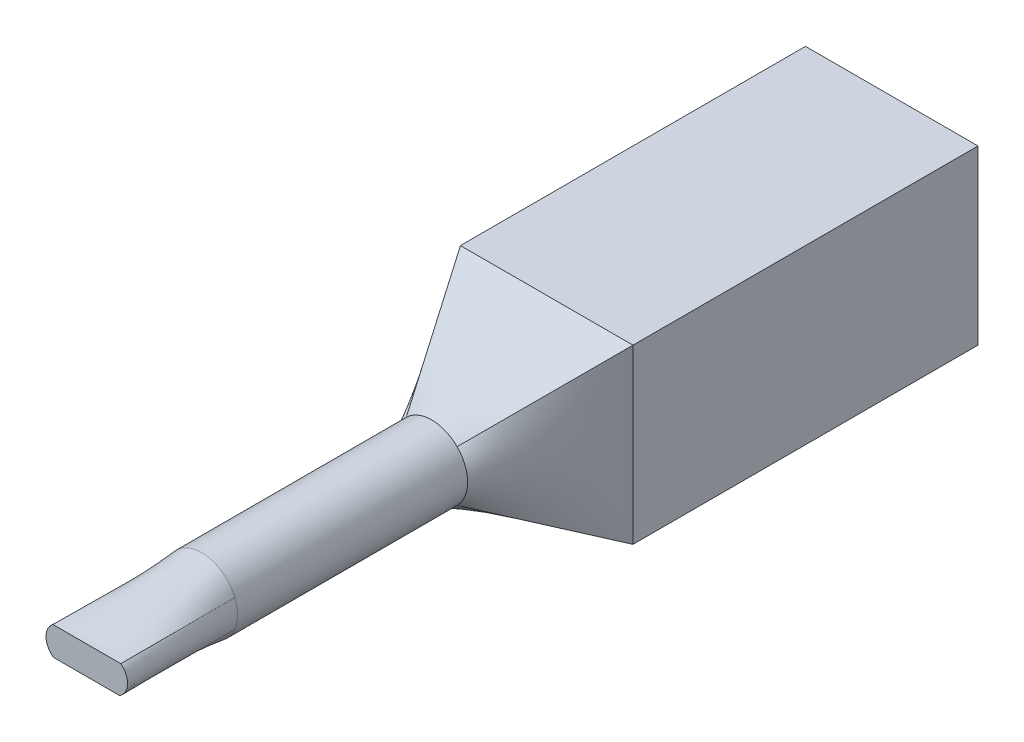
ISO-10303-21;
HEADER;
FILE_DESCRIPTION(('STEP AP214'),'2;1');
FILE_NAME('part.step','',(''),(''),'','','');
FILE_SCHEMA(('AUTOMOTIVE_DESIGN { 1 0 10303 214 1 1 1 1 }'));
ENDSEC;
DATA;
#1=APPLICATION_CONTEXT('core data for automotive mechanical design processes');
#2=APPLICATION_PROTOCOL_DEFINITION('international standard','automotive_design',2000,#1);
#3=PRODUCT_CONTEXT('',#1,'mechanical');
#4=PRODUCT('Part','Part','',(#3));
#5=PRODUCT_RELATED_PRODUCT_CATEGORY('part','',(#4));
#6=PRODUCT_DEFINITION_FORMATION('','',#4);
#7=PRODUCT_DEFINITION_CONTEXT('part definition',#1,'design');
#8=PRODUCT_DEFINITION('design','',#6,#7);
#9=PRODUCT_DEFINITION_SHAPE('','',#8);
#10=(LENGTH_UNIT() NAMED_UNIT(*) SI_UNIT(.MILLI.,.METRE.));
#11=(NAMED_UNIT(*) PLANE_ANGLE_UNIT() SI_UNIT($,.RADIAN.));
#12=(NAMED_UNIT(*) SI_UNIT($,.STERADIAN.) SOLID_ANGLE_UNIT());
#13=UNCERTAINTY_MEASURE_WITH_UNIT(LENGTH_MEASURE(1.E-05),#10,'distance_accuracy_value','');
#14=(GEOMETRIC_REPRESENTATION_CONTEXT(3) GLOBAL_UNCERTAINTY_ASSIGNED_CONTEXT((#13)) GLOBAL_UNIT_ASSIGNED_CONTEXT((#10,
#11,#12)) REPRESENTATION_CONTEXT('',''));
#15=CARTESIAN_POINT('',(0.,0.,0.));
#16=DIRECTION('',(0.,0.,1.));
#17=DIRECTION('',(1.,0.,0.));
#18=AXIS2_PLACEMENT_3D('',#15,#16,#17);
#19=CARTESIAN_POINT('',(0.,0.,38.1));
#20=DIRECTION('',(1.,0.,0.));
#21=DIRECTION('',(0.,0.,-1.));
#22=AXIS2_PLACEMENT_3D('',#19,#20,#21);
#23=PLANE('',#22);
#24=DIRECTION('',(0.,-1.,0.));
#25=VECTOR('',#24,1.);
#26=CARTESIAN_POINT('',(0.,0.,0.));
#27=LINE('',#26,#25);
#28=CARTESIAN_POINT('',(0.,19.05,0.));
#29=VERTEX_POINT('',#28);
#30=CARTESIAN_POINT('',(0.,0.,0.));
#31=VERTEX_POINT('',#30);
#32=EDGE_CURVE('E511',#29,#31,#27,.T.);
#33=ORIENTED_EDGE('',*,*,#32,.T.);
#34=DIRECTION('',(0.,0.,-1.));
#35=VECTOR('',#34,1.);
#36=CARTESIAN_POINT('',(0.,0.,38.1));
#37=LINE('',#36,#35);
#38=CARTESIAN_POINT('',(0.,0.,38.1));
#39=VERTEX_POINT('',#38);
#40=EDGE_CURVE('E12',#39,#31,#37,.T.);
#41=ORIENTED_EDGE('',*,*,#40,.F.);
#42=DIRECTION('',(0.,1.,0.));
#43=VECTOR('',#42,1.);
#44=CARTESIAN_POINT('',(0.,0.,38.1));
#45=LINE('',#44,#43);
#46=CARTESIAN_POINT('',(0.,19.05,38.1));
#47=VERTEX_POINT('',#46);
#48=EDGE_CURVE('E525',#47,#39,#45,.F.);
#49=ORIENTED_EDGE('',*,*,#48,.F.);
#50=DIRECTION('',(0.,0.,-1.));
#51=VECTOR('',#50,1.);
#52=CARTESIAN_POINT('',(0.,19.05,38.1));
#53=LINE('',#52,#51);
#54=EDGE_CURVE('E526',#47,#29,#53,.T.);
#55=ORIENTED_EDGE('',*,*,#54,.T.);
#56=EDGE_LOOP('',(#33,#41,#49,#55));
#57=FACE_BOUND('',#56,.T.);
#58=ADVANCED_FACE('F105',(#57),#23,.F.);
#59=CARTESIAN_POINT('',(0.,0.,38.1));
#60=DIRECTION('',(0.,1.,0.));
#61=DIRECTION('',(0.,0.,1.));
#62=AXIS2_PLACEMENT_3D('',#59,#60,#61);
#63=PLANE('',#62);
#64=DIRECTION('',(1.,0.,0.));
#65=VECTOR('',#64,1.);
#66=CARTESIAN_POINT('',(0.,0.,0.));
#67=LINE('',#66,#65);
#68=CARTESIAN_POINT('',(19.05,0.,0.));
#69=VERTEX_POINT('',#68);
#70=EDGE_CURVE('E519',#31,#69,#67,.T.);
#71=ORIENTED_EDGE('',*,*,#70,.T.);
#72=DIRECTION('',(0.,0.,-1.));
#73=VECTOR('',#72,1.);
#74=CARTESIAN_POINT('',(19.05,0.,38.1));
#75=LINE('',#74,#73);
#76=CARTESIAN_POINT('',(19.05,0.,38.1));
#77=VERTEX_POINT('',#76);
#78=EDGE_CURVE('E114',#77,#69,#75,.T.);
#79=ORIENTED_EDGE('',*,*,#78,.F.);
#80=DIRECTION('',(1.,0.,0.));
#81=VECTOR('',#80,1.);
#82=CARTESIAN_POINT('',(0.,0.,38.1));
#83=LINE('',#82,#81);
#84=EDGE_CURVE('E462',#39,#77,#83,.T.);
#85=ORIENTED_EDGE('',*,*,#84,.F.);
#86=ORIENTED_EDGE('',*,*,#40,.T.);
#87=EDGE_LOOP('',(#71,#79,#85,#86));
#88=FACE_BOUND('',#87,.T.);
#89=ADVANCED_FACE('F565',(#88),#63,.F.);
#90=CARTESIAN_POINT('',(19.05,0.,38.1));
#91=DIRECTION('',(-1.,0.,0.));
#92=DIRECTION('',(0.,0.,1.));
#93=AXIS2_PLACEMENT_3D('',#90,#91,#92);
#94=PLANE('',#93);
#95=DIRECTION('',(0.,1.,0.));
#96=VECTOR('',#95,1.);
#97=CARTESIAN_POINT('',(19.05,0.,0.));
#98=LINE('',#97,#96);
#99=CARTESIAN_POINT('',(19.05,19.05,0.));
#100=VERTEX_POINT('',#99);
#101=EDGE_CURVE('E521',#69,#100,#98,.T.);
#102=ORIENTED_EDGE('',*,*,#101,.T.);
#103=DIRECTION('',(0.,0.,-1.));
#104=VECTOR('',#103,1.);
#105=CARTESIAN_POINT('',(19.05,19.05,38.1));
#106=LINE('',#105,#104);
#107=CARTESIAN_POINT('',(19.05,19.05,38.1));
#108=VERTEX_POINT('',#107);
#109=EDGE_CURVE('E529',#108,#100,#106,.T.);
#110=ORIENTED_EDGE('',*,*,#109,.F.);
#111=DIRECTION('',(0.,1.,0.));
#112=VECTOR('',#111,1.);
#113=CARTESIAN_POINT('',(19.05,0.,38.1));
#114=LINE('',#113,#112);
#115=EDGE_CURVE('E536',#77,#108,#114,.T.);
#116=ORIENTED_EDGE('',*,*,#115,.F.);
#117=ORIENTED_EDGE('',*,*,#78,.T.);
#118=EDGE_LOOP('',(#102,#110,#116,#117));
#119=FACE_BOUND('',#118,.T.);
#120=ADVANCED_FACE('F567',(#119),#94,.F.);
#121=CARTESIAN_POINT('',(0.,19.05,38.1));
#122=DIRECTION('',(0.,-1.,0.));
#123=DIRECTION('',(0.,0.,-1.));
#124=AXIS2_PLACEMENT_3D('',#121,#122,#123);
#125=PLANE('',#124);
#126=DIRECTION('',(-1.,0.,0.));
#127=VECTOR('',#126,1.);
#128=CARTESIAN_POINT('',(0.,19.05,0.));
#129=LINE('',#128,#127);
#130=EDGE_CURVE('E523',#100,#29,#129,.T.);
#131=ORIENTED_EDGE('',*,*,#130,.T.);
#132=ORIENTED_EDGE('',*,*,#54,.F.);
#133=DIRECTION('',(1.,0.,0.));
#134=VECTOR('',#133,1.);
#135=CARTESIAN_POINT('',(0.,19.05,38.1));
#136=LINE('',#135,#134);
#137=EDGE_CURVE('E434',#108,#47,#136,.F.);
#138=ORIENTED_EDGE('',*,*,#137,.F.);
#139=ORIENTED_EDGE('',*,*,#109,.T.);
#140=EDGE_LOOP('',(#131,#132,#138,#139));
#141=FACE_BOUND('',#140,.T.);
#142=ADVANCED_FACE('F559',(#141),#125,.F.);
#143=CARTESIAN_POINT('',(0.,0.,0.));
#144=DIRECTION('',(0.,0.,-1.));
#145=DIRECTION('',(-1.,0.,0.));
#146=AXIS2_PLACEMENT_3D('',#143,#144,#145);
#147=PLANE('',#146);
#148=ORIENTED_EDGE('',*,*,#32,.F.);
#149=ORIENTED_EDGE('',*,*,#130,.F.);
#150=ORIENTED_EDGE('',*,*,#101,.F.);
#151=ORIENTED_EDGE('',*,*,#70,.F.);
#152=EDGE_LOOP('',(#148,#149,#150,#151));
#153=FACE_BOUND('',#152,.T.);
#154=ADVANCED_FACE('F563',(#153),#147,.T.);
#155=CARTESIAN_POINT('',(12.3313300378341,12.3313300378341,50.8));
#156=CARTESIAN_POINT('',(19.05,19.05,38.1));
#157=CARTESIAN_POINT('',(12.6620592045008,12.0006008711674,50.8));
#158=CARTESIAN_POINT('',(19.05,17.4625,38.1));
#159=CARTESIAN_POINT('',(12.9585981787103,11.5835090371438,50.8));
#160=CARTESIAN_POINT('',(19.05,15.875,38.1));
#161=CARTESIAN_POINT('',(13.3759779779088,10.6190861586301,50.8));
#162=CARTESIAN_POINT('',(19.05,12.7,38.1));
#163=CARTESIAN_POINT('',(13.49375,10.0729700252227,50.8));
#164=CARTESIAN_POINT('',(19.05,11.1125,38.1));
#165=CARTESIAN_POINT('',(13.49375,8.97702997477725,50.8));
#166=CARTESIAN_POINT('',(19.05,7.93749999999999,38.1));
#167=CARTESIAN_POINT('',(13.3759779779088,8.43091384136988,50.8));
#168=CARTESIAN_POINT('',(19.05,6.34999999999999,38.1));
#169=CARTESIAN_POINT('',(12.9585981787103,7.46649096285624,50.8));
#170=CARTESIAN_POINT('',(19.05,3.175,38.1));
#171=CARTESIAN_POINT('',(12.6620592045008,7.04939912883255,50.8));
#172=CARTESIAN_POINT('',(19.05,1.5875,38.1));
#173=CARTESIAN_POINT('',(12.3313300378341,6.71866996216589,50.8));
#174=CARTESIAN_POINT('',(19.05,0.,38.1));
#175=B_SPLINE_SURFACE_WITH_KNOTS('',3,1,((#155,#156),(#157,#158),(#159,#160),(#161,#162),(#163,
#164),(#165,#166),(#167,#168),(#169,#170),(#171,#172),(#173,#174)),.UNSPECIFIED.,.F.,.F.,.F.,(4,
2,2,2,4),(2,2),(0.,0.25,0.5,0.75,1.),(0.,1.),.UNSPECIFIED.);
#176=CARTESIAN_POINT('',(9.525,9.525,50.8));
#177=DIRECTION('',(0.,0.,1.));
#178=DIRECTION('',(1.,0.,0.));
#179=AXIS2_PLACEMENT_3D('',#176,#177,#178);
#180=CIRCLE('',#179,3.96875);
#181=CARTESIAN_POINT('',(12.3313300378341,6.71866996216589,50.8));
#182=VERTEX_POINT('',#181);
#183=CARTESIAN_POINT('',(12.3313300378341,12.3313300378341,50.8));
#184=VERTEX_POINT('',#183);
#185=EDGE_CURVE('E430',#182,#184,#180,.T.);
#186=DIRECTION('',(0.423597096817351,-0.423597096817351,-0.800706562440838));
#187=VECTOR('',#186,1.);
#188=CARTESIAN_POINT('',(15.6906650189171,3.35933498108294,44.45));
#189=LINE('',#188,#187);
#190=EDGE_CURVE('E452',#182,#77,#189,.T.);
#191=DIRECTION('',(-0.423597096817351,-0.423597096817351,0.800706562440838));
#192=VECTOR('',#191,1.);
#193=CARTESIAN_POINT('',(15.6906650189171,15.6906650189171,44.45));
#194=LINE('',#193,#192);
#195=EDGE_CURVE('E445',#108,#184,#194,.T.);
#196=ORIENTED_EDGE('',*,*,#185,.F.);
#197=ORIENTED_EDGE('',*,*,#190,.T.);
#198=ORIENTED_EDGE('',*,*,#115,.T.);
#199=ORIENTED_EDGE('',*,*,#195,.T.);
#200=EDGE_LOOP('',(#196,#197,#198,#199));
#201=FACE_BOUND('',#200,.T.);
#202=ADVANCED_FACE('F361',(#201),#175,.T.);
#203=CARTESIAN_POINT('',(12.3313300378341,6.71866996216589,50.8));
#204=CARTESIAN_POINT('',(19.05,0.,38.1));
#205=CARTESIAN_POINT('',(12.0006008711674,6.38794079549922,50.8));
#206=CARTESIAN_POINT('',(17.4625,0.,38.1));
#207=CARTESIAN_POINT('',(11.5835090371438,6.09140182128975,50.8));
#208=CARTESIAN_POINT('',(15.875,0.,38.1));
#209=CARTESIAN_POINT('',(10.6190861586301,5.67402202209115,50.8));
#210=CARTESIAN_POINT('',(12.7,0.,38.1));
#211=CARTESIAN_POINT('',(10.0729700252227,5.55625,50.8));
#212=CARTESIAN_POINT('',(11.1125,0.,38.1));
#213=CARTESIAN_POINT('',(8.97702997477727,5.55625,50.8));
#214=CARTESIAN_POINT('',(7.93749999999998,0.,38.1));
#215=CARTESIAN_POINT('',(8.43091384136989,5.67402202209115,50.8));
#216=CARTESIAN_POINT('',(6.34999999999998,0.,38.1));
#217=CARTESIAN_POINT('',(7.46649096285624,6.09140182128975,50.8));
#218=CARTESIAN_POINT('',(3.17499999999999,0.,38.1));
#219=CARTESIAN_POINT('',(7.04939912883256,6.38794079549922,50.8));
#220=CARTESIAN_POINT('',(1.58749999999999,0.,38.1));
#221=CARTESIAN_POINT('',(6.71866996216589,6.71866996216589,50.8));
#222=CARTESIAN_POINT('',(0.,0.,38.1));
#223=B_SPLINE_SURFACE_WITH_KNOTS('',3,1,((#203,#204),(#205,#206),(#207,#208),(#209,#210),(#211,
#212),(#213,#214),(#215,#216),(#217,#218),(#219,#220),(#221,#222)),.UNSPECIFIED.,.F.,.F.,.F.,(4,
2,2,2,4),(2,2),(0.,0.25,0.5,0.75,1.),(0.,1.),.UNSPECIFIED.);
#224=CARTESIAN_POINT('',(6.71866996216589,6.71866996216589,50.8));
#225=VERTEX_POINT('',#224);
#226=EDGE_CURVE('E444',#225,#182,#180,.T.);
#227=DIRECTION('',(-0.423597096817352,-0.423597096817351,-0.800706562440837));
#228=VECTOR('',#227,1.);
#229=CARTESIAN_POINT('',(3.35933498108295,3.35933498108294,44.45));
#230=LINE('',#229,#228);
#231=EDGE_CURVE('E463',#225,#39,#230,.T.);
#232=ORIENTED_EDGE('',*,*,#226,.F.);
#233=ORIENTED_EDGE('',*,*,#231,.T.);
#234=ORIENTED_EDGE('',*,*,#84,.T.);
#235=ORIENTED_EDGE('',*,*,#190,.F.);
#236=EDGE_LOOP('',(#232,#233,#234,#235));
#237=FACE_BOUND('',#236,.T.);
#238=ADVANCED_FACE('F458',(#237),#223,.T.);
#239=CARTESIAN_POINT('',(6.71866996216589,12.3313300378341,50.8));
#240=CARTESIAN_POINT('',(0.,19.05,38.1));
#241=CARTESIAN_POINT('',(7.04939912883256,12.6620592045008,50.8));
#242=CARTESIAN_POINT('',(1.5875,19.05,38.1));
#243=CARTESIAN_POINT('',(7.46649096285624,12.9585981787103,50.8));
#244=CARTESIAN_POINT('',(3.17499999999999,19.05,38.1));
#245=CARTESIAN_POINT('',(8.43091384136989,13.3759779779088,50.8));
#246=CARTESIAN_POINT('',(6.34999999999999,19.05,38.1));
#247=CARTESIAN_POINT('',(8.97702997477727,13.49375,50.8));
#248=CARTESIAN_POINT('',(7.93749999999999,19.05,38.1));
#249=CARTESIAN_POINT('',(10.0729700252227,13.49375,50.8));
#250=CARTESIAN_POINT('',(11.1125,19.05,38.1));
#251=CARTESIAN_POINT('',(10.6190861586301,13.3759779779088,50.8));
#252=CARTESIAN_POINT('',(12.7,19.05,38.1));
#253=CARTESIAN_POINT('',(11.5835090371438,12.9585981787103,50.8));
#254=CARTESIAN_POINT('',(15.875,19.05,38.1));
#255=CARTESIAN_POINT('',(12.0006008711675,12.6620592045008,50.8));
#256=CARTESIAN_POINT('',(17.4625,19.05,38.1));
#257=CARTESIAN_POINT('',(12.3313300378341,12.3313300378341,50.8));
#258=CARTESIAN_POINT('',(19.05,19.05,38.1));
#259=B_SPLINE_SURFACE_WITH_KNOTS('',3,1,((#239,#240),(#241,#242),(#243,#244),(#245,#246),(#247,
#248),(#249,#250),(#251,#252),(#253,#254),(#255,#256),(#257,#258)),.UNSPECIFIED.,.F.,.F.,.F.,(4,
2,2,2,4),(2,2),(0.,0.25,0.5,0.75,1.),(0.,1.),.UNSPECIFIED.);
#260=CARTESIAN_POINT('',(6.71866996216589,12.3313300378341,50.8));
#261=VERTEX_POINT('',#260);
#262=EDGE_CURVE('E344',#184,#261,#180,.T.);
#263=DIRECTION('',(-0.423597096817352,0.423597096817351,-0.800706562440837));
#264=VECTOR('',#263,1.);
#265=CARTESIAN_POINT('',(3.35933498108295,15.6906650189171,44.45));
#266=LINE('',#265,#264);
#267=EDGE_CURVE('E465',#261,#47,#266,.T.);
#268=ORIENTED_EDGE('',*,*,#262,.F.);
#269=ORIENTED_EDGE('',*,*,#195,.F.);
#270=ORIENTED_EDGE('',*,*,#137,.T.);
#271=ORIENTED_EDGE('',*,*,#267,.F.);
#272=EDGE_LOOP('',(#268,#269,#270,#271));
#273=FACE_BOUND('',#272,.T.);
#274=ADVANCED_FACE('F487',(#273),#259,.T.);
#275=CARTESIAN_POINT('',(6.71866996216589,6.71866996216589,50.8));
#276=CARTESIAN_POINT('',(0.,0.,38.1));
#277=CARTESIAN_POINT('',(6.38794079549923,7.04939912883255,50.8));
#278=CARTESIAN_POINT('',(0.,1.5875,38.1));
#279=CARTESIAN_POINT('',(6.09140182128975,7.46649096285624,50.8));
#280=CARTESIAN_POINT('',(0.,3.175,38.1));
#281=CARTESIAN_POINT('',(5.67402202209116,8.43091384136989,50.8));
#282=CARTESIAN_POINT('',(0.,6.35,38.1));
#283=CARTESIAN_POINT('',(5.55625000000001,8.97702997477726,50.8));
#284=CARTESIAN_POINT('',(0.,7.9375,38.1));
#285=CARTESIAN_POINT('',(5.55625,10.0729700252227,50.8));
#286=CARTESIAN_POINT('',(0.,11.1125,38.1));
#287=CARTESIAN_POINT('',(5.67402202209116,10.6190861586301,50.8));
#288=CARTESIAN_POINT('',(0.,12.7,38.1));
#289=CARTESIAN_POINT('',(6.09140182128975,11.5835090371438,50.8));
#290=CARTESIAN_POINT('',(0.,15.875,38.1));
#291=CARTESIAN_POINT('',(6.38794079549923,12.0006008711674,50.8));
#292=CARTESIAN_POINT('',(0.,17.4625,38.1));
#293=CARTESIAN_POINT('',(6.71866996216589,12.3313300378341,50.8));
#294=CARTESIAN_POINT('',(0.,19.05,38.1));
#295=B_SPLINE_SURFACE_WITH_KNOTS('',3,1,((#275,#276),(#277,#278),(#279,#280),(#281,#282),(#283,
#284),(#285,#286),(#287,#288),(#289,#290),(#291,#292),(#293,#294)),.UNSPECIFIED.,.F.,.F.,.F.,(4,
2,2,2,4),(2,2),(0.,0.25,0.5,0.75,1.),(0.,1.),.UNSPECIFIED.);
#296=EDGE_CURVE('E427',#261,#225,#180,.T.);
#297=ORIENTED_EDGE('',*,*,#296,.F.);
#298=ORIENTED_EDGE('',*,*,#267,.T.);
#299=ORIENTED_EDGE('',*,*,#48,.T.);
#300=ORIENTED_EDGE('',*,*,#231,.F.);
#301=EDGE_LOOP('',(#297,#298,#299,#300));
#302=FACE_BOUND('',#301,.T.);
#303=ADVANCED_FACE('F360',(#302),#295,.T.);
#304=CARTESIAN_POINT('',(9.525,9.525,76.2));
#305=DIRECTION('',(0.,0.,-1.));
#306=DIRECTION('',(-1.,0.,0.));
#307=AXIS2_PLACEMENT_3D('',#304,#305,#306);
#308=CYLINDRICAL_SURFACE('',#307,3.96875);
#309=CARTESIAN_POINT('',(13.1895942944799,11.0487208469288,76.2));
#310=CARTESIAN_POINT('',(13.0724038507494,11.3305673756601,76.2));
#311=CARTESIAN_POINT('',(12.9132796322586,11.6214082209229,76.2));
#312=CARTESIAN_POINT('',(12.4905007981669,12.1860470328806,76.2));
#313=CARTESIAN_POINT('',(12.2262208988449,12.4595845803328,76.2));
#314=CARTESIAN_POINT('',(11.5918514076672,12.9362323670643,76.2));
#315=CARTESIAN_POINT('',(11.2214527817845,13.13844245403,76.2));
#316=CARTESIAN_POINT('',(10.4103264823499,13.41744337519,76.2));
#317=CARTESIAN_POINT('',(9.97026674481439,13.4932500022138,76.2));
#318=CARTESIAN_POINT('',(9.08869146355692,13.4942449426981,76.2));
#319=CARTESIAN_POINT('',(8.64846173747379,13.4194318049926,76.2));
#320=CARTESIAN_POINT('',(7.83670774766605,13.1422624566265,76.2));
#321=CARTESIAN_POINT('',(7.46585363979375,12.9408889429741,76.2));
#322=CARTESIAN_POINT('',(6.83040988243937,12.4656742597282,76.2));
#323=CARTESIAN_POINT('',(6.56551323152774,12.1927339377023,76.2));
#324=CARTESIAN_POINT('',(6.14146098022822,11.6290508541414,76.2));
#325=CARTESIAN_POINT('',(5.98168068552648,11.3385699225667,76.2));
#326=CARTESIAN_POINT('',(5.86385436059671,11.0569886323267,76.2));
#327=B_SPLINE_CURVE_WITH_KNOTS('',3,(#309,#310,#311,#312,#313,#314,#315,#316,#317,#318,#319,
#320,#321,#322,#323,#324,#325,#326),.UNSPECIFIED.,.F.,.F.,(4,2,2,2,2,2,2,2,4),(0.,0.125,0.25,
0.375,0.5,0.625,0.75,0.875,1.),.UNSPECIFIED.);
#328=CARTESIAN_POINT('',(13.1895946681988,11.048721002088,76.2));
#329=VERTEX_POINT('',#328);
#330=CARTESIAN_POINT('',(5.8638547311129,11.056988477299,76.2));
#331=VERTEX_POINT('',#330);
#332=EDGE_CURVE('E214',#329,#331,#327,.T.);
#333=ORIENTED_EDGE('',*,*,#332,.F.);
#334=CARTESIAN_POINT('',(9.525,9.525,76.2));
#335=DIRECTION('',(0.,0.,-1.));
#336=DIRECTION('',(1.,0.,0.));
#337=AXIS2_PLACEMENT_3D('',#334,#335,#336);
#338=CIRCLE('',#337,3.96875);
#339=CARTESIAN_POINT('',(13.1758502556261,7.96863242215289,76.2));
#340=VERTEX_POINT('',#339);
#341=EDGE_CURVE('E108',#340,#329,#338,.F.);
#342=ORIENTED_EDGE('',*,*,#341,.F.);
#343=CARTESIAN_POINT('',(9.525,9.525,76.2));
#344=DIRECTION('',(0.,0.,1.));
#345=DIRECTION('',(1.,0.,0.));
#346=AXIS2_PLACEMENT_3D('',#343,#344,#345);
#347=CIRCLE('',#346,3.96875);
#348=CARTESIAN_POINT('',(5.87047963638837,7.97726280235899,76.2));
#349=VERTEX_POINT('',#348);
#350=EDGE_CURVE('E122',#349,#340,#347,.T.);
#351=ORIENTED_EDGE('',*,*,#350,.F.);
#352=CARTESIAN_POINT('',(9.525,9.525,76.2));
#353=DIRECTION('',(0.,0.,1.));
#354=DIRECTION('',(1.,0.,0.));
#355=AXIS2_PLACEMENT_3D('',#352,#353,#354);
#356=CIRCLE('',#355,3.96875);
#357=EDGE_CURVE('E127',#331,#349,#356,.T.);
#358=ORIENTED_EDGE('',*,*,#357,.F.);
#359=EDGE_LOOP('',(#333,#342,#351,#358));
#360=FACE_BOUND('',#359,.T.);
#361=ORIENTED_EDGE('',*,*,#262,.T.);
#362=ORIENTED_EDGE('',*,*,#296,.T.);
#363=ORIENTED_EDGE('',*,*,#226,.T.);
#364=ORIENTED_EDGE('',*,*,#185,.T.);
#365=EDGE_LOOP('',(#361,#362,#363,#364));
#366=FACE_BOUND('',#365,.T.);
#367=ADVANCED_FACE('F351',(#360,#366),#308,.T.);
#368=CARTESIAN_POINT('',(6.95825771919827,9.58132210141995,88.9));
#369=DIRECTION('',(0.,0.,1.));
#370=DIRECTION('',(1.,0.,0.));
#371=AXIS2_PLACEMENT_3D('',#368,#369,#370);
#372=PLANE('',#371);
#373=CARTESIAN_POINT('',(6.95825771919827,9.58132210141995,88.9));
#374=DIRECTION('',(0.,0.,1.));
#375=DIRECTION('',(1.,0.,0.));
#376=AXIS2_PLACEMENT_3D('',#373,#374,#375);
#377=CIRCLE('',#376,1.92144479313224);
#378=CARTESIAN_POINT('',(5.79898387858335,11.1136517838059,88.9));
#379=VERTEX_POINT('',#378);
#380=CARTESIAN_POINT('',(5.8703987195828,7.99749354693224,88.9));
#381=VERTEX_POINT('',#380);
#382=EDGE_CURVE('E190',#379,#381,#377,.T.);
#383=ORIENTED_EDGE('',*,*,#382,.T.);
#384=DIRECTION('',(1.,0.,0.));
#385=VECTOR('',#384,1.);
#386=CARTESIAN_POINT('',(5.87039871958281,7.99749354693224,88.9));
#387=LINE('',#386,#385);
#388=CARTESIAN_POINT('',(13.1796012804172,7.99749354693224,88.9));
#389=VERTEX_POINT('',#388);
#390=EDGE_CURVE('E209',#381,#389,#387,.T.);
#391=ORIENTED_EDGE('',*,*,#390,.T.);
#392=CARTESIAN_POINT('',(12.1172726383406,9.59855817688283,88.9));
#393=DIRECTION('',(0.,0.,1.));
#394=DIRECTION('',(-1.,0.,0.));
#395=AXIS2_PLACEMENT_3D('',#392,#393,#394);
#396=CIRCLE('',#395,1.92144479313224);
#397=CARTESIAN_POINT('',(13.2989838785833,11.1136517838059,88.9));
#398=VERTEX_POINT('',#397);
#399=EDGE_CURVE('E192',#389,#398,#396,.T.);
#400=ORIENTED_EDGE('',*,*,#399,.T.);
#401=DIRECTION('',(-1.,0.,0.));
#402=VECTOR('',#401,1.);
#403=CARTESIAN_POINT('',(5.79898387858335,11.1136517838059,88.9));
#404=LINE('',#403,#402);
#405=EDGE_CURVE('E185',#398,#379,#404,.T.);
#406=ORIENTED_EDGE('',*,*,#405,.T.);
#407=EDGE_LOOP('',(#383,#391,#400,#406));
#408=FACE_BOUND('',#407,.T.);
#409=ADVANCED_FACE('F188',(#408),#372,.T.);
#410=CARTESIAN_POINT('',(5.86385436059671,11.0569886323267,76.2));
#411=CARTESIAN_POINT('',(5.79898387858335,11.1136517838059,88.9));
#412=CARTESIAN_POINT('',(5.76481115107302,10.8202952215476,76.2));
#413=CARTESIAN_POINT('',(5.59183786523653,10.9569368436588,88.9));
#414=CARTESIAN_POINT('',(5.68763880913233,10.5687837631057,76.2));
#415=CARTESIAN_POINT('',(5.39380777808517,10.7385107632771,88.9));
#416=CARTESIAN_POINT('',(5.58308906086634,10.0505906861923,76.2));
#417=CARTESIAN_POINT('',(5.11072469193382,10.1922320215772,88.9));
#418=CARTESIAN_POINT('',(5.55571165454105,9.78390906772083,76.2));
#419=CARTESIAN_POINT('',(5.02980741400623,9.86499028606469,88.9));
#420=CARTESIAN_POINT('',(5.55680497795532,9.24984160604467,76.2));
#421=CARTESIAN_POINT('',(5.04482721430819,9.20960726242234,88.9));
#422=CARTESIAN_POINT('',(5.58527403198597,8.98327431440848,76.2));
#423=CARTESIAN_POINT('',(5.14065084980423,8.88641600293533,88.9));
#424=CARTESIAN_POINT('',(5.69194454695988,8.46551363990852,76.2));
#425=CARTESIAN_POINT('',(5.44846237456767,8.35367914244887,88.9));
#426=CARTESIAN_POINT('',(5.77014600790315,8.21432025704474,76.2));
#427=CARTESIAN_POINT('',(5.6562908975793,8.14455436383355,88.9));
#428=CARTESIAN_POINT('',(5.87015748343549,7.97803434375149,76.2));
#429=CARTESIAN_POINT('',(5.8703987195828,7.99749354693224,88.9));
#430=B_SPLINE_SURFACE_WITH_KNOTS('',3,1,((#410,#411),(#412,#413),(#414,#415),(#416,#417),(#418,
#419),(#420,#421),(#422,#423),(#424,#425),(#426,#427),(#428,#429)),.UNSPECIFIED.,.F.,.F.,.F.,(4,
2,2,2,4),(2,2),(0.,0.25,0.5,0.75,1.),(0.,1.),.UNSPECIFIED.);
#431=DIRECTION('',(1.89949499288908E-05,0.00153221892402257,0.999998825971491));
#432=VECTOR('',#431,1.);
#433=CARTESIAN_POINT('',(5.87027810150915,7.98776394534187,82.55));
#434=LINE('',#433,#432);
#435=EDGE_CURVE('E208',#349,#381,#434,.T.);
#436=DIRECTION('',(0.00510779449872449,-0.00446156286222869,-0.999977002181643));
#437=VECTOR('',#436,1.);
#438=CARTESIAN_POINT('',(5.83141911959003,11.0853202080663,82.55));
#439=LINE('',#438,#437);
#440=EDGE_CURVE('E198',#379,#331,#439,.T.);
#441=CARTESIAN_POINT('',(5.86385436059671,11.0569886323267,76.2));
#442=CARTESIAN_POINT('',(5.79898387858335,11.1136517838059,88.9));
#443=CARTESIAN_POINT('',(5.76481115107302,10.8202952215476,76.2));
#444=CARTESIAN_POINT('',(5.59183786523653,10.9569368436588,88.9));
#445=CARTESIAN_POINT('',(5.68763880913233,10.5687837631057,76.2));
#446=CARTESIAN_POINT('',(5.39380777808517,10.7385107632771,88.9));
#447=CARTESIAN_POINT('',(5.58308906086634,10.0505906861923,76.2));
#448=CARTESIAN_POINT('',(5.11072469193382,10.1922320215772,88.9));
#449=CARTESIAN_POINT('',(5.55571165454105,9.78390906772083,76.2));
#450=CARTESIAN_POINT('',(5.02980741400623,9.86499028606469,88.9));
#451=CARTESIAN_POINT('',(5.55680497795532,9.24984160604467,76.2));
#452=CARTESIAN_POINT('',(5.04482721430819,9.20960726242234,88.9));
#453=CARTESIAN_POINT('',(5.58527403198597,8.98327431440848,76.2));
#454=CARTESIAN_POINT('',(5.14065084980423,8.88641600293533,88.9));
#455=CARTESIAN_POINT('',(5.69194454695988,8.46551363990852,76.2));
#456=CARTESIAN_POINT('',(5.44846237456767,8.35367914244887,88.9));
#457=CARTESIAN_POINT('',(5.77014600790315,8.21432025704474,76.2));
#458=CARTESIAN_POINT('',(5.6562908975793,8.14455436383355,88.9));
#459=CARTESIAN_POINT('',(5.87015748343549,7.97803434375149,76.2));
#460=CARTESIAN_POINT('',(5.8703987195828,7.99749354693224,88.9));
#461=CARTESIAN_POINT('',(5.87029349904221,7.97771299490941,76.2));
#462=CARTESIAN_POINT('',(5.87068990622073,7.99729354422125,88.9));
#463=CARTESIAN_POINT('',(5.87042951464894,7.97739164606734,76.2));
#464=CARTESIAN_POINT('',(5.87098109285865,7.99709354151027,88.9));
#465=CARTESIAN_POINT('',(5.87056553025566,7.97707029722526,76.2));
#466=CARTESIAN_POINT('',(5.87127227949658,7.99689353879928,88.9));
#467=B_SPLINE_SURFACE_WITH_KNOTS('',3,1,((#441,#442),(#443,#444),(#445,#446),(#447,#448),(#449,
#450),(#451,#452),(#453,#454),(#455,#456),(#457,#458),(#459,#460),(#461,#462),(#463,#464),(#465,
#466)),.UNSPECIFIED.,.F.,.F.,.F.,(4,2,2,2,3,4),(2,2),(0.,0.25,0.5,0.75,1.,1.00034),(0.,1.),.UNSPECIFIED.);
#468=ORIENTED_EDGE('',*,*,#357,.T.);
#469=ORIENTED_EDGE('',*,*,#435,.T.);
#470=ORIENTED_EDGE('',*,*,#382,.F.);
#471=ORIENTED_EDGE('',*,*,#440,.T.);
#472=EDGE_LOOP('',(#468,#469,#470,#471));
#473=FACE_BOUND('',#472,.T.);
#474=ADVANCED_FACE('F206',(#473),#467,.T.);
#475=CARTESIAN_POINT('',(5.87015748343549,7.97803434375149,76.2));
#476=CARTESIAN_POINT('',(5.87039871958281,7.99749354693224,88.9));
#477=CARTESIAN_POINT('',(5.98881507351411,7.69769534373508,76.2));
#478=CARTESIAN_POINT('',(6.17494882628424,7.99749354693224,88.9));
#479=CARTESIAN_POINT('',(6.14917544810664,7.40883917943925,76.2));
#480=CARTESIAN_POINT('',(6.47949893298566,7.99749354693224,88.9));
#481=CARTESIAN_POINT('',(6.57326780161163,6.84888246658714,76.2));
#482=CARTESIAN_POINT('',(7.08859914638852,7.99749354693224,88.9));
#483=CARTESIAN_POINT('',(6.8376046342439,6.57804530814177,76.1999999999999));
#484=CARTESIAN_POINT('',(7.39314925308995,7.99749354693224,88.9));
#485=CARTESIAN_POINT('',(7.47038605498572,6.1066382074588,76.1999999999999));
#486=CARTESIAN_POINT('',(8.00224946649281,7.99749354693224,88.9));
#487=CARTESIAN_POINT('',(7.83912005167733,5.90694509227487,76.2));
#488=CARTESIAN_POINT('',(8.30679957319425,7.99749354693224,88.9));
#489=CARTESIAN_POINT('',(8.64552875283562,5.63153845005739,76.2));
#490=CARTESIAN_POINT('',(8.91589978659711,7.99749354693224,88.9));
#491=CARTESIAN_POINT('',(9.08255118801654,5.55677303480962,76.2));
#492=CARTESIAN_POINT('',(9.22044989329855,7.99749354693224,88.9));
#493=CARTESIAN_POINT('',(9.95801532856906,5.55573257090003,76.2));
#494=CARTESIAN_POINT('',(9.82955010670141,7.99749354693224,88.9));
#495=CARTESIAN_POINT('',(10.3952142420282,5.6294589992606,76.2));
#496=CARTESIAN_POINT('',(10.1341002134028,7.99749354693224,88.9));
#497=CARTESIAN_POINT('',(11.2022752899389,5.90294807916415,76.2));
#498=CARTESIAN_POINT('',(10.7432004268057,7.99749354693224,88.9));
#499=CARTESIAN_POINT('',(11.5714829033435,6.10176417200402,76.2));
#500=CARTESIAN_POINT('',(11.0477505335071,7.99749354693224,88.9));
#501=CARTESIAN_POINT('',(12.2053830424601,6.57166585814523,76.2));
#502=CARTESIAN_POINT('',(11.65685074691,7.99749354693224,88.9));
#503=CARTESIAN_POINT('',(12.4703628917721,6.84187393896332,76.2));
#504=CARTESIAN_POINT('',(11.9614008536114,7.99749354693224,88.9));
#505=CARTESIAN_POINT('',(12.8957850302113,7.40082102831563,76.2));
#506=CARTESIAN_POINT('',(12.5705010670143,7.99749354693224,88.9));
#507=CARTESIAN_POINT('',(13.0568315452873,7.68929520978258,76.2));
#508=CARTESIAN_POINT('',(12.8750511737158,7.99749354693224,88.9));
#509=CARTESIAN_POINT('',(13.1761551488764,7.96935137600637,76.2));
#510=CARTESIAN_POINT('',(13.1796012804172,7.99749354693224,88.9));
#511=B_SPLINE_SURFACE_WITH_KNOTS('',3,1,((#475,#476),(#477,#478),(#479,#480),(#481,#482),(#483,
#484),(#485,#486),(#487,#488),(#489,#490),(#491,#492),(#493,#494),(#495,#496),(#497,#498),(#499,
#500),(#501,#502),(#503,#504),(#505,#506),(#507,#508),(#509,#510)),.UNSPECIFIED.,.F.,.F.,.F.,(4,
2,2,2,2,2,2,2,4),(2,2),(0.,0.125,0.25,0.374999999999999,0.499999999999999,0.624999999999999,
0.75,0.875,1.),(0.,1.),.UNSPECIFIED.);
#512=DIRECTION('',(0.000271348264029398,0.00221591344857203,0.999997508045749));
#513=VECTOR('',#512,1.);
#514=CARTESIAN_POINT('',(13.1778782146468,7.98342246146931,82.55));
#515=LINE('',#514,#513);
#516=EDGE_CURVE('E314',#340,#389,#515,.T.);
#517=ORIENTED_EDGE('',*,*,#350,.T.);
#518=ORIENTED_EDGE('',*,*,#516,.T.);
#519=ORIENTED_EDGE('',*,*,#390,.F.);
#520=ORIENTED_EDGE('',*,*,#435,.F.);
#521=EDGE_LOOP('',(#517,#518,#519,#520));
#522=FACE_BOUND('',#521,.T.);
#523=ADVANCED_FACE('F235',(#522),#511,.T.);
#524=CARTESIAN_POINT('',(13.1895942944799,11.0487208469288,76.2));
#525=CARTESIAN_POINT('',(13.2989838785833,11.1136517838059,88.9));
#526=CARTESIAN_POINT('',(13.0724038507494,11.3305673756601,76.2));
#527=CARTESIAN_POINT('',(12.9864838785833,11.1136517838059,88.9));
#528=CARTESIAN_POINT('',(12.9132796322586,11.6214082209229,76.2));
#529=CARTESIAN_POINT('',(12.6739838785833,11.1136517838059,88.9));
#530=CARTESIAN_POINT('',(12.4905007981669,12.1860470328806,76.2));
#531=CARTESIAN_POINT('',(12.0489838785833,11.1136517838059,88.9));
#532=CARTESIAN_POINT('',(12.2262208988449,12.4595845803328,76.2));
#533=CARTESIAN_POINT('',(11.7364838785833,11.1136517838059,88.9));
#534=CARTESIAN_POINT('',(11.5918514076672,12.9362323670643,76.2));
#535=CARTESIAN_POINT('',(11.1114838785833,11.1136517838059,88.9));
#536=CARTESIAN_POINT('',(11.2214527817845,13.13844245403,76.2));
#537=CARTESIAN_POINT('',(10.7989838785833,11.1136517838059,88.9));
#538=CARTESIAN_POINT('',(10.4103264823499,13.41744337519,76.2));
#539=CARTESIAN_POINT('',(10.1739838785833,11.1136517838059,88.9));
#540=CARTESIAN_POINT('',(9.97026674481439,13.4932500022138,76.2));
#541=CARTESIAN_POINT('',(9.86148387858335,11.1136517838059,88.9));
#542=CARTESIAN_POINT('',(9.08869146355692,13.4942449426981,76.2));
#543=CARTESIAN_POINT('',(9.23648387858335,11.1136517838059,88.9));
#544=CARTESIAN_POINT('',(8.64846173747379,13.4194318049926,76.2));
#545=CARTESIAN_POINT('',(8.92398387858335,11.1136517838059,88.9));
#546=CARTESIAN_POINT('',(7.83670774766605,13.1422624566265,76.2));
#547=CARTESIAN_POINT('',(8.29898387858335,11.1136517838059,88.9));
#548=CARTESIAN_POINT('',(7.46585363979375,12.9408889429741,76.2));
#549=CARTESIAN_POINT('',(7.98648387858335,11.1136517838059,88.9));
#550=CARTESIAN_POINT('',(6.83040988243937,12.4656742597282,76.2));
#551=CARTESIAN_POINT('',(7.36148387858335,11.1136517838059,88.9));
#552=CARTESIAN_POINT('',(6.56551323152774,12.1927339377023,76.2));
#553=CARTESIAN_POINT('',(7.04898387858335,11.1136517838059,88.9));
#554=CARTESIAN_POINT('',(6.14146098022822,11.6290508541414,76.2));
#555=CARTESIAN_POINT('',(6.42398387858335,11.1136517838059,88.9));
#556=CARTESIAN_POINT('',(5.98168068552648,11.3385699225667,76.2));
#557=CARTESIAN_POINT('',(6.11148387858335,11.1136517838059,88.9));
#558=CARTESIAN_POINT('',(5.86385436059671,11.0569886323267,76.2));
#559=CARTESIAN_POINT('',(5.79898387858335,11.1136517838059,88.9));
#560=B_SPLINE_SURFACE_WITH_KNOTS('',3,1,((#524,#525),(#526,#527),(#528,#529),(#530,#531),(#532,
#533),(#534,#535),(#536,#537),(#538,#539),(#540,#541),(#542,#543),(#544,#545),(#546,#547),(#548,
#549),(#550,#551),(#552,#553),(#554,#555),(#556,#557),(#558,#559)),.UNSPECIFIED.,.F.,.F.,.F.,(4,
2,2,2,2,2,2,2,4),(2,2),(0.,0.125,0.25,0.375,0.5,0.625,0.75,0.875,1.),(0.,1.),.UNSPECIFIED.);
#561=DIRECTION('',(0.0086129210258156,0.00511241573901456,0.999949839140301));
#562=VECTOR('',#561,1.);
#563=CARTESIAN_POINT('',(13.2442890865316,11.0811863153673,82.55));
#564=LINE('',#563,#562);
#565=EDGE_CURVE('E315',#329,#398,#564,.T.);
#566=ORIENTED_EDGE('',*,*,#332,.T.);
#567=ORIENTED_EDGE('',*,*,#440,.F.);
#568=ORIENTED_EDGE('',*,*,#405,.F.);
#569=ORIENTED_EDGE('',*,*,#565,.F.);
#570=EDGE_LOOP('',(#566,#567,#568,#569));
#571=FACE_BOUND('',#570,.T.);
#572=ADVANCED_FACE('F213',(#571),#560,.T.);
#573=CARTESIAN_POINT('',(13.1761551488764,7.96935137600637,76.2));
#574=CARTESIAN_POINT('',(13.1796012804172,7.99749354693224,88.9));
#575=CARTESIAN_POINT('',(13.2767422880009,8.20543248407976,76.2));
#576=CARTESIAN_POINT('',(13.3961410582449,8.14117070014145,88.9));
#577=CARTESIAN_POINT('',(13.3555487650494,8.45647804101666,76.2));
#578=CARTESIAN_POINT('',(13.6074151550647,8.34707974657691,88.9));
#579=CARTESIAN_POINT('',(13.4634509365031,8.9740650844743,76.2));
#580=CARTESIAN_POINT('',(13.9238102691459,8.87527070280758,88.9));
#581=CARTESIAN_POINT('',(13.4925466309083,9.24060657099505,76.2));
#582=CARTESIAN_POINT('',(14.0247505784218,9.197198866742,88.9));
#583=CARTESIAN_POINT('',(13.4948777785848,9.77475250547721,76.2));
#584=CARTESIAN_POINT('',(14.049867243235,9.85280113325799,88.9));
#585=CARTESIAN_POINT('',(13.4681096568452,10.0415377957916,76.2));
#586=CARTESIAN_POINT('',(13.9738533213178,10.1815085600765,88.9));
#587=CARTESIAN_POINT('',(13.3647292706199,10.5600469296587,76.2));
#588=CARTESIAN_POINT('',(13.6987971561499,10.7323585037649,88.9));
#589=CARTESIAN_POINT('',(13.2881170061341,10.8117707732113,76.2));
#590=CARTESIAN_POINT('',(13.5038963017885,10.9538284483628,88.9));
#591=CARTESIAN_POINT('',(13.1895942944799,11.0487208469288,76.2));
#592=CARTESIAN_POINT('',(13.2989838785833,11.1136517838059,88.9));
#593=B_SPLINE_SURFACE_WITH_KNOTS('',3,1,((#573,#574),(#575,#576),(#577,#578),(#579,#580),(#581,
#582),(#583,#584),(#585,#586),(#587,#588),(#589,#590),(#591,#592)),.UNSPECIFIED.,.F.,.F.,.F.,(4,
2,2,2,4),(2,2),(0.,0.25,0.5,0.75,1.),(0.,1.),.UNSPECIFIED.);
#594=CARTESIAN_POINT('',(13.1757688942622,7.96844482455137,76.2));
#595=CARTESIAN_POINT('',(13.1787697676703,7.99694182666392,88.9));
#596=CARTESIAN_POINT('',(13.1758976458003,7.96874700836971,76.2));
#597=CARTESIAN_POINT('',(13.179046938586,7.99712573342003,88.9));
#598=CARTESIAN_POINT('',(13.1760263973383,7.96904919218804,76.2));
#599=CARTESIAN_POINT('',(13.1793241095016,7.99730964017613,88.9));
#600=CARTESIAN_POINT('',(13.1761551488764,7.96935137600637,76.2));
#601=CARTESIAN_POINT('',(13.1796012804172,7.99749354693224,88.9));
#602=CARTESIAN_POINT('',(13.2767422880009,8.20543248407976,76.2));
#603=CARTESIAN_POINT('',(13.3961410582449,8.14117070014145,88.9));
#604=CARTESIAN_POINT('',(13.3555487650494,8.45647804101666,76.2));
#605=CARTESIAN_POINT('',(13.6074151550647,8.34707974657691,88.9));
#606=CARTESIAN_POINT('',(13.4634509365031,8.9740650844743,76.2));
#607=CARTESIAN_POINT('',(13.9238102691459,8.87527070280758,88.9));
#608=CARTESIAN_POINT('',(13.4925466309083,9.24060657099505,76.2));
#609=CARTESIAN_POINT('',(14.0247505784218,9.197198866742,88.9));
#610=CARTESIAN_POINT('',(13.4948777785848,9.77475250547721,76.2));
#611=CARTESIAN_POINT('',(14.049867243235,9.85280113325799,88.9));
#612=CARTESIAN_POINT('',(13.4681096568452,10.0415377957916,76.2));
#613=CARTESIAN_POINT('',(13.9738533213178,10.1815085600765,88.9));
#614=CARTESIAN_POINT('',(13.3647292706199,10.5600469296587,76.2));
#615=CARTESIAN_POINT('',(13.6987971561499,10.7323585037649,88.9));
#616=CARTESIAN_POINT('',(13.2881170061341,10.8117707732113,76.2));
#617=CARTESIAN_POINT('',(13.5038963017885,10.9538284483628,88.9));
#618=CARTESIAN_POINT('',(13.1895942944799,11.0487208469288,76.2));
#619=CARTESIAN_POINT('',(13.2989838785833,11.1136517838059,88.9));
#620=B_SPLINE_SURFACE_WITH_KNOTS('',3,1,((#594,#595),(#596,#597),(#598,#599),(#600,#601),(#602,
#603),(#604,#605),(#606,#607),(#608,#609),(#610,#611),(#612,#613),(#614,#615),(#616,#617),(#618,
#619)),.UNSPECIFIED.,.F.,.F.,.F.,(4,3,2,2,2,4),(2,2),(-0.00032,0.,0.25,0.5,0.75,1.),(0.,1.),.UNSPECIFIED.);
#621=ORIENTED_EDGE('',*,*,#341,.T.);
#622=ORIENTED_EDGE('',*,*,#565,.T.);
#623=ORIENTED_EDGE('',*,*,#399,.F.);
#624=ORIENTED_EDGE('',*,*,#516,.F.);
#625=EDGE_LOOP('',(#621,#622,#623,#624));
#626=FACE_BOUND('',#625,.T.);
#627=ADVANCED_FACE('F234',(#626),#620,.T.);
#628=CLOSED_SHELL('',(#58,#89,#120,#142,#154,#202,#238,#274,#303,#367,#409,#474,#523,#572,#627));
#629=MANIFOLD_SOLID_BREP('B2',#628);
#630=ADVANCED_BREP_SHAPE_REPRESENTATION('',(#18,#629),#14);
#631=SHAPE_DEFINITION_REPRESENTATION(#9,#630);
ENDSEC;
END-ISO-10303-21;
